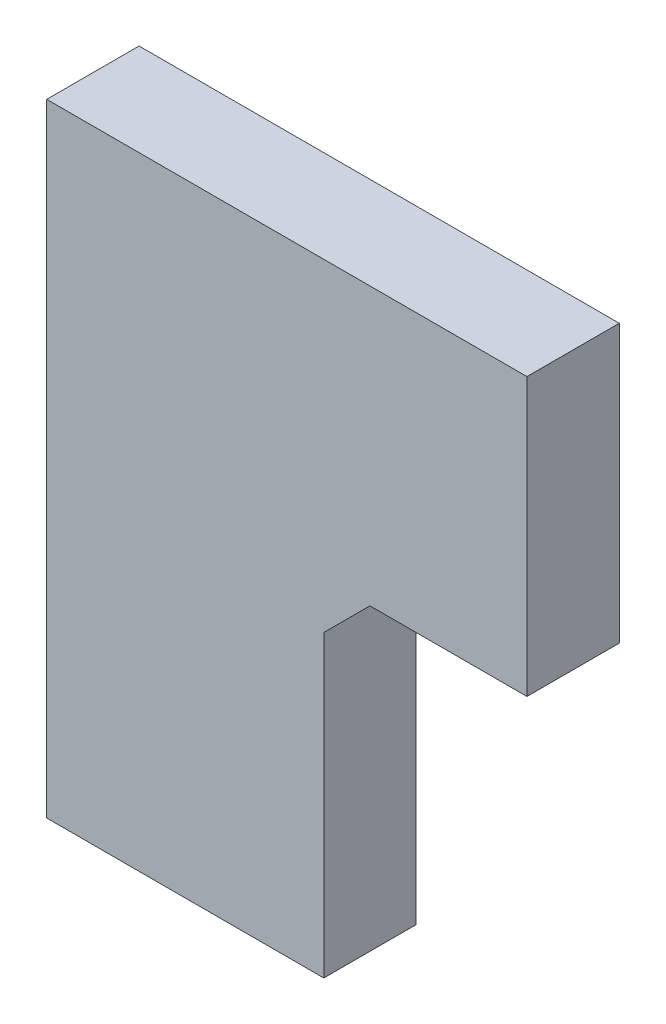
ISO-10303-21;
HEADER;
FILE_DESCRIPTION(('STEP AP214'),'2;1');
FILE_NAME('part.step','',(''),(''),'','','');
FILE_SCHEMA(('AUTOMOTIVE_DESIGN { 1 0 10303 214 1 1 1 1 }'));
ENDSEC;
DATA;
#1=APPLICATION_CONTEXT('core data for automotive mechanical design processes');
#2=APPLICATION_PROTOCOL_DEFINITION('international standard','automotive_design',2000,#1);
#3=PRODUCT_CONTEXT('',#1,'mechanical');
#4=PRODUCT('Part','Part','',(#3));
#5=PRODUCT_RELATED_PRODUCT_CATEGORY('part','',(#4));
#6=PRODUCT_DEFINITION_FORMATION('','',#4);
#7=PRODUCT_DEFINITION_CONTEXT('part definition',#1,'design');
#8=PRODUCT_DEFINITION('design','',#6,#7);
#9=PRODUCT_DEFINITION_SHAPE('','',#8);
#10=(LENGTH_UNIT() NAMED_UNIT(*) SI_UNIT(.MILLI.,.METRE.));
#11=(NAMED_UNIT(*) PLANE_ANGLE_UNIT() SI_UNIT($,.RADIAN.));
#12=(NAMED_UNIT(*) SI_UNIT($,.STERADIAN.) SOLID_ANGLE_UNIT());
#13=UNCERTAINTY_MEASURE_WITH_UNIT(LENGTH_MEASURE(1.E-05),#10,'distance_accuracy_value','');
#14=(GEOMETRIC_REPRESENTATION_CONTEXT(3) GLOBAL_UNCERTAINTY_ASSIGNED_CONTEXT((#13)) GLOBAL_UNIT_ASSIGNED_CONTEXT((#10,
#11,#12)) REPRESENTATION_CONTEXT('',''));
#15=CARTESIAN_POINT('',(0.,0.,0.));
#16=DIRECTION('',(0.,0.,1.));
#17=DIRECTION('',(1.,0.,0.));
#18=AXIS2_PLACEMENT_3D('',#15,#16,#17);
#19=CARTESIAN_POINT('',(0.,0.,0.5));
#20=DIRECTION('',(0.,0.,1.));
#21=DIRECTION('',(1.,0.,0.));
#22=AXIS2_PLACEMENT_3D('',#19,#20,#21);
#23=PLANE('',#22);
#24=DIRECTION('',(0.,-1.,0.));
#25=VECTOR('',#24,1.);
#26=CARTESIAN_POINT('',(3.2000000000007,0.,0.5));
#27=LINE('',#26,#25);
#28=CARTESIAN_POINT('',(3.2000000000007,1.1286796564444,0.5));
#29=VERTEX_POINT('',#28);
#30=CARTESIAN_POINT('',(3.2000000000007,-2.2413203435652,0.5));
#31=VERTEX_POINT('',#30);
#32=EDGE_CURVE('E11',#29,#31,#27,.T.);
#33=ORIENTED_EDGE('',*,*,#32,.T.);
#34=DIRECTION('',(1.,0.,0.));
#35=VECTOR('',#34,1.);
#36=CARTESIAN_POINT('',(0.,-2.2413203435652,0.5));
#37=LINE('',#36,#35);
#38=CARTESIAN_POINT('',(4.7000000000013,-2.2413203435652,0.5));
#39=VERTEX_POINT('',#38);
#40=EDGE_CURVE('E24',#31,#39,#37,.T.);
#41=ORIENTED_EDGE('',*,*,#40,.T.);
#42=DIRECTION('',(0.,1.,0.));
#43=VECTOR('',#42,1.);
#44=CARTESIAN_POINT('',(4.7000000000013,0.,0.5));
#45=LINE('',#44,#43);
#46=CARTESIAN_POINT('',(4.7000000000013,-0.621320343563162,0.5));
#47=VERTEX_POINT('',#46);
#48=EDGE_CURVE('E132',#39,#47,#45,.T.);
#49=ORIENTED_EDGE('',*,*,#48,.T.);
#50=DIRECTION('',(-0.707106781186547,-0.707106781186548,0.));
#51=VECTOR('',#50,1.);
#52=CARTESIAN_POINT('',(2.6606601717822,-2.6606601717822,0.5));
#53=LINE('',#52,#51);
#54=CARTESIAN_POINT('',(4.9500000000013,-0.371320343563211,0.5));
#55=VERTEX_POINT('',#54);
#56=EDGE_CURVE('E130',#55,#47,#53,.T.);
#57=ORIENTED_EDGE('',*,*,#56,.F.);
#58=DIRECTION('',(-1.,0.,0.));
#59=VECTOR('',#58,1.);
#60=CARTESIAN_POINT('',(0.,-0.371320343563212,0.5));
#61=LINE('',#60,#59);
#62=CARTESIAN_POINT('',(5.8000000000007,-0.371320343563211,0.5));
#63=VERTEX_POINT('',#62);
#64=EDGE_CURVE('E96',#63,#55,#61,.T.);
#65=ORIENTED_EDGE('',*,*,#64,.F.);
#66=DIRECTION('',(0.,-1.,0.));
#67=VECTOR('',#66,1.);
#68=CARTESIAN_POINT('',(5.8000000000007,0.,0.5));
#69=LINE('',#68,#67);
#70=CARTESIAN_POINT('',(5.8000000000007,1.1286796564444,0.5));
#71=VERTEX_POINT('',#70);
#72=EDGE_CURVE('E126',#71,#63,#69,.T.);
#73=ORIENTED_EDGE('',*,*,#72,.F.);
#74=DIRECTION('',(-1.,0.,0.));
#75=VECTOR('',#74,1.);
#76=CARTESIAN_POINT('',(0.,1.1286796564444,0.5));
#77=LINE('',#76,#75);
#78=EDGE_CURVE('E124',#71,#29,#77,.T.);
#79=ORIENTED_EDGE('',*,*,#78,.T.);
#80=EDGE_LOOP('',(#33,#41,#49,#57,#65,#73,#79));
#81=FACE_BOUND('',#80,.T.);
#82=ADVANCED_FACE('F17',(#81),#23,.T.);
#83=CARTESIAN_POINT('',(4.7000000000013,0.,0.5));
#84=DIRECTION('',(-1.,0.,0.));
#85=DIRECTION('',(0.,0.,1.));
#86=AXIS2_PLACEMENT_3D('',#83,#84,#85);
#87=PLANE('',#86);
#88=DIRECTION('',(0.,0.,1.));
#89=VECTOR('',#88,1.);
#90=CARTESIAN_POINT('',(4.7000000000013,-2.2413203435652,0.5));
#91=LINE('',#90,#89);
#92=CARTESIAN_POINT('',(4.7000000000013,-2.2413203435652,0.));
#93=VERTEX_POINT('',#92);
#94=EDGE_CURVE('E121',#93,#39,#91,.T.);
#95=ORIENTED_EDGE('',*,*,#94,.F.);
#96=DIRECTION('',(0.,1.,0.));
#97=VECTOR('',#96,1.);
#98=CARTESIAN_POINT('',(4.7000000000013,0.,0.));
#99=LINE('',#98,#97);
#100=CARTESIAN_POINT('',(4.7000000000013,-0.621320343563162,0.));
#101=VERTEX_POINT('',#100);
#102=EDGE_CURVE('E119',#93,#101,#99,.T.);
#103=ORIENTED_EDGE('',*,*,#102,.T.);
#104=DIRECTION('',(0.,0.,-1.));
#105=VECTOR('',#104,1.);
#106=CARTESIAN_POINT('',(4.7000000000013,-0.621320343563162,0.5));
#107=LINE('',#106,#105);
#108=EDGE_CURVE('E91',#47,#101,#107,.T.);
#109=ORIENTED_EDGE('',*,*,#108,.F.);
#110=ORIENTED_EDGE('',*,*,#48,.F.);
#111=EDGE_LOOP('',(#95,#103,#109,#110));
#112=FACE_BOUND('',#111,.T.);
#113=ADVANCED_FACE('F136',(#112),#87,.F.);
#114=CARTESIAN_POINT('',(0.,0.,0.));
#115=DIRECTION('',(0.,0.,1.));
#116=DIRECTION('',(1.,0.,0.));
#117=AXIS2_PLACEMENT_3D('',#114,#115,#116);
#118=PLANE('',#117);
#119=DIRECTION('',(1.,0.,0.));
#120=VECTOR('',#119,1.);
#121=CARTESIAN_POINT('',(0.,-2.2413203435652,0.));
#122=LINE('',#121,#120);
#123=CARTESIAN_POINT('',(3.2000000000007,-2.2413203435652,0.));
#124=VERTEX_POINT('',#123);
#125=EDGE_CURVE('E115',#124,#93,#122,.T.);
#126=ORIENTED_EDGE('',*,*,#125,.F.);
#127=DIRECTION('',(0.,-1.,0.));
#128=VECTOR('',#127,1.);
#129=CARTESIAN_POINT('',(3.2000000000007,0.,0.));
#130=LINE('',#129,#128);
#131=CARTESIAN_POINT('',(3.2000000000007,1.1286796564444,0.));
#132=VERTEX_POINT('',#131);
#133=EDGE_CURVE('E112',#132,#124,#130,.T.);
#134=ORIENTED_EDGE('',*,*,#133,.F.);
#135=DIRECTION('',(-1.,0.,0.));
#136=VECTOR('',#135,1.);
#137=CARTESIAN_POINT('',(0.,1.1286796564444,0.));
#138=LINE('',#137,#136);
#139=CARTESIAN_POINT('',(5.8000000000007,1.1286796564444,0.));
#140=VERTEX_POINT('',#139);
#141=EDGE_CURVE('E109',#140,#132,#138,.T.);
#142=ORIENTED_EDGE('',*,*,#141,.F.);
#143=DIRECTION('',(0.,-1.,0.));
#144=VECTOR('',#143,1.);
#145=CARTESIAN_POINT('',(5.8000000000007,0.,0.));
#146=LINE('',#145,#144);
#147=CARTESIAN_POINT('',(5.8000000000007,-0.371320343563211,0.));
#148=VERTEX_POINT('',#147);
#149=EDGE_CURVE('E78',#140,#148,#146,.T.);
#150=ORIENTED_EDGE('',*,*,#149,.T.);
#151=DIRECTION('',(-1.,0.,0.));
#152=VECTOR('',#151,1.);
#153=CARTESIAN_POINT('',(0.,-0.371320343563212,0.));
#154=LINE('',#153,#152);
#155=CARTESIAN_POINT('',(4.9500000000013,-0.371320343563211,0.));
#156=VERTEX_POINT('',#155);
#157=EDGE_CURVE('E72',#148,#156,#154,.T.);
#158=ORIENTED_EDGE('',*,*,#157,.T.);
#159=DIRECTION('',(-0.707106781186547,-0.707106781186548,0.));
#160=VECTOR('',#159,1.);
#161=CARTESIAN_POINT('',(2.6606601717822,-2.6606601717822,0.));
#162=LINE('',#161,#160);
#163=EDGE_CURVE('E76',#156,#101,#162,.T.);
#164=ORIENTED_EDGE('',*,*,#163,.T.);
#165=ORIENTED_EDGE('',*,*,#102,.F.);
#166=EDGE_LOOP('',(#126,#134,#142,#150,#158,#164,#165));
#167=FACE_BOUND('',#166,.T.);
#168=ADVANCED_FACE('F74',(#167),#118,.F.);
#169=CARTESIAN_POINT('',(3.2000000000007,0.,0.5));
#170=DIRECTION('',(1.,0.,0.));
#171=DIRECTION('',(0.,1.,0.));
#172=AXIS2_PLACEMENT_3D('',#169,#170,#171);
#173=PLANE('',#172);
#174=DIRECTION('',(0.,0.,-1.));
#175=VECTOR('',#174,1.);
#176=CARTESIAN_POINT('',(3.2000000000007,-2.2413203435652,0.5));
#177=LINE('',#176,#175);
#178=EDGE_CURVE('E92',#31,#124,#177,.T.);
#179=ORIENTED_EDGE('',*,*,#178,.F.);
#180=ORIENTED_EDGE('',*,*,#32,.F.);
#181=DIRECTION('',(0.,0.,-1.));
#182=VECTOR('',#181,1.);
#183=CARTESIAN_POINT('',(3.2000000000007,1.1286796564444,0.5));
#184=LINE('',#183,#182);
#185=EDGE_CURVE('E104',#29,#132,#184,.T.);
#186=ORIENTED_EDGE('',*,*,#185,.T.);
#187=ORIENTED_EDGE('',*,*,#133,.T.);
#188=EDGE_LOOP('',(#179,#180,#186,#187));
#189=FACE_BOUND('',#188,.T.);
#190=ADVANCED_FACE('F138',(#189),#173,.F.);
#191=CARTESIAN_POINT('',(0.,1.1286796564444,0.5));
#192=DIRECTION('',(0.,-1.,0.));
#193=DIRECTION('',(1.,0.,0.));
#194=AXIS2_PLACEMENT_3D('',#191,#192,#193);
#195=PLANE('',#194);
#196=ORIENTED_EDGE('',*,*,#141,.T.);
#197=ORIENTED_EDGE('',*,*,#185,.F.);
#198=ORIENTED_EDGE('',*,*,#78,.F.);
#199=DIRECTION('',(0.,0.,-1.));
#200=VECTOR('',#199,1.);
#201=CARTESIAN_POINT('',(5.8000000000007,1.1286796564444,0.5));
#202=LINE('',#201,#200);
#203=EDGE_CURVE('E99',#71,#140,#202,.T.);
#204=ORIENTED_EDGE('',*,*,#203,.T.);
#205=EDGE_LOOP('',(#196,#197,#198,#204));
#206=FACE_BOUND('',#205,.T.);
#207=ADVANCED_FACE('F142',(#206),#195,.F.);
#208=CARTESIAN_POINT('',(5.8000000000007,0.,0.5));
#209=DIRECTION('',(1.,0.,0.));
#210=DIRECTION('',(0.,0.,-1.));
#211=AXIS2_PLACEMENT_3D('',#208,#209,#210);
#212=PLANE('',#211);
#213=ORIENTED_EDGE('',*,*,#149,.F.);
#214=ORIENTED_EDGE('',*,*,#203,.F.);
#215=ORIENTED_EDGE('',*,*,#72,.T.);
#216=DIRECTION('',(0.,0.,-1.));
#217=VECTOR('',#216,1.);
#218=CARTESIAN_POINT('',(5.8000000000007,-0.371320343563211,0.5));
#219=LINE('',#218,#217);
#220=EDGE_CURVE('E97',#63,#148,#219,.T.);
#221=ORIENTED_EDGE('',*,*,#220,.T.);
#222=EDGE_LOOP('',(#213,#214,#215,#221));
#223=FACE_BOUND('',#222,.T.);
#224=ADVANCED_FACE('F145',(#223),#212,.T.);
#225=CARTESIAN_POINT('',(0.,-0.371320343563212,0.5));
#226=DIRECTION('',(0.,-1.,0.));
#227=DIRECTION('',(1.,0.,0.));
#228=AXIS2_PLACEMENT_3D('',#225,#226,#227);
#229=PLANE('',#228);
#230=ORIENTED_EDGE('',*,*,#157,.F.);
#231=ORIENTED_EDGE('',*,*,#220,.F.);
#232=ORIENTED_EDGE('',*,*,#64,.T.);
#233=DIRECTION('',(0.,0.,-1.));
#234=VECTOR('',#233,1.);
#235=CARTESIAN_POINT('',(4.9500000000013,-0.371320343563211,0.5));
#236=LINE('',#235,#234);
#237=EDGE_CURVE('E89',#55,#156,#236,.T.);
#238=ORIENTED_EDGE('',*,*,#237,.T.);
#239=EDGE_LOOP('',(#230,#231,#232,#238));
#240=FACE_BOUND('',#239,.T.);
#241=ADVANCED_FACE('F95',(#240),#229,.T.);
#242=CARTESIAN_POINT('',(2.6606601717822,-2.6606601717822,0.5));
#243=DIRECTION('',(0.707106781186548,-0.707106781186547,0.));
#244=DIRECTION('',(0.707106781186547,0.707106781186548,0.));
#245=AXIS2_PLACEMENT_3D('',#242,#243,#244);
#246=PLANE('',#245);
#247=ORIENTED_EDGE('',*,*,#163,.F.);
#248=ORIENTED_EDGE('',*,*,#237,.F.);
#249=ORIENTED_EDGE('',*,*,#56,.T.);
#250=ORIENTED_EDGE('',*,*,#108,.T.);
#251=EDGE_LOOP('',(#247,#248,#249,#250));
#252=FACE_BOUND('',#251,.T.);
#253=ADVANCED_FACE('F87',(#252),#246,.T.);
#254=CARTESIAN_POINT('',(3.88578058618805E-13,-2.2413203435652,-0.01));
#255=DIRECTION('',(0.,-1.,0.));
#256=DIRECTION('',(1.,0.,0.));
#257=AXIS2_PLACEMENT_3D('',#254,#255,#256);
#258=PLANE('',#257);
#259=ORIENTED_EDGE('',*,*,#40,.F.);
#260=ORIENTED_EDGE('',*,*,#178,.T.);
#261=ORIENTED_EDGE('',*,*,#125,.T.);
#262=ORIENTED_EDGE('',*,*,#94,.T.);
#263=EDGE_LOOP('',(#259,#260,#261,#262));
#264=FACE_BOUND('',#263,.T.);
#265=ADVANCED_FACE('F137',(#264),#258,.T.);
#266=CLOSED_SHELL('',(#82,#113,#168,#190,#207,#224,#241,#253,#265));
#267=MANIFOLD_SOLID_BREP('B1',#266);
#268=ADVANCED_BREP_SHAPE_REPRESENTATION('',(#18,#267),#14);
#269=SHAPE_DEFINITION_REPRESENTATION(#9,#268);
ENDSEC;
END-ISO-10303-21;
